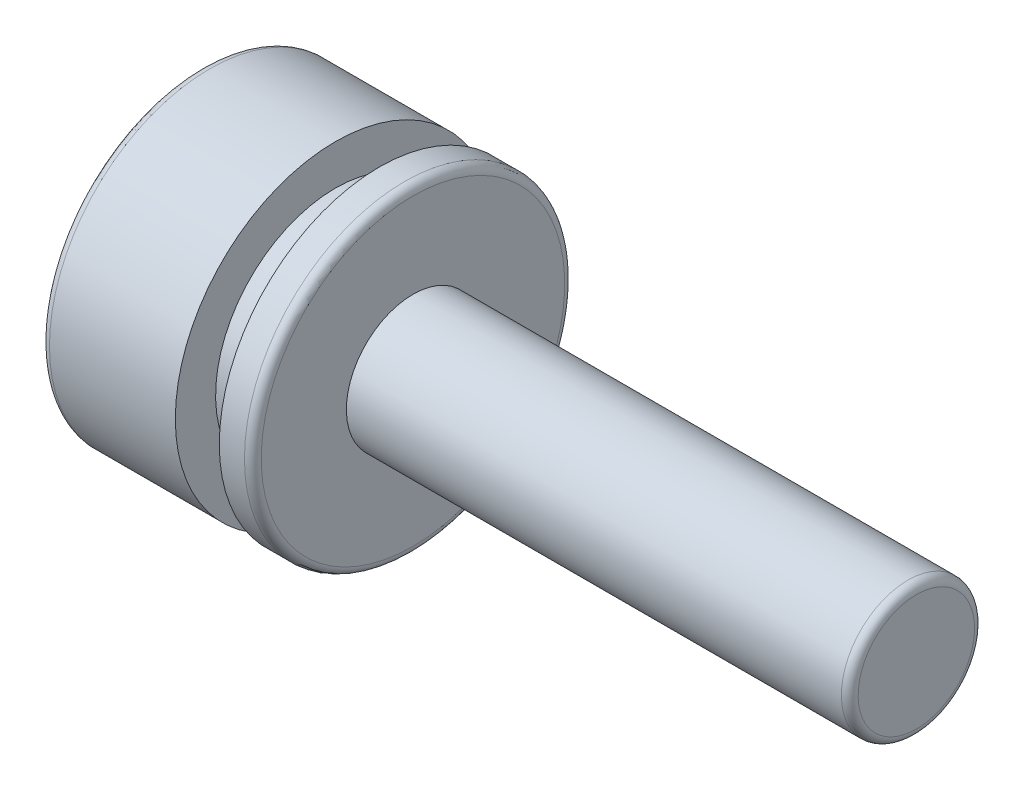
ISO-10303-21;
HEADER;
FILE_DESCRIPTION(('STEP AP214'),'2;1');
FILE_NAME('part.step','',(''),(''),'','','');
FILE_SCHEMA(('AUTOMOTIVE_DESIGN { 1 0 10303 214 1 1 1 1 }'));
ENDSEC;
DATA;
#1=APPLICATION_CONTEXT('core data for automotive mechanical design processes');
#2=APPLICATION_PROTOCOL_DEFINITION('international standard','automotive_design',2000,#1);
#3=PRODUCT_CONTEXT('',#1,'mechanical');
#4=PRODUCT('Part','Part','',(#3));
#5=PRODUCT_RELATED_PRODUCT_CATEGORY('part','',(#4));
#6=PRODUCT_DEFINITION_FORMATION('','',#4);
#7=PRODUCT_DEFINITION_CONTEXT('part definition',#1,'design');
#8=PRODUCT_DEFINITION('design','',#6,#7);
#9=PRODUCT_DEFINITION_SHAPE('','',#8);
#10=(LENGTH_UNIT() NAMED_UNIT(*) SI_UNIT(.MILLI.,.METRE.));
#11=(NAMED_UNIT(*) PLANE_ANGLE_UNIT() SI_UNIT($,.RADIAN.));
#12=(NAMED_UNIT(*) SI_UNIT($,.STERADIAN.) SOLID_ANGLE_UNIT());
#13=UNCERTAINTY_MEASURE_WITH_UNIT(LENGTH_MEASURE(1.E-05),#10,'distance_accuracy_value','');
#14=(GEOMETRIC_REPRESENTATION_CONTEXT(3) GLOBAL_UNCERTAINTY_ASSIGNED_CONTEXT((#13)) GLOBAL_UNIT_ASSIGNED_CONTEXT((#10,
#11,#12)) REPRESENTATION_CONTEXT('',''));
#15=CARTESIAN_POINT('',(0.,0.,0.));
#16=DIRECTION('',(0.,0.,1.));
#17=DIRECTION('',(1.,0.,0.));
#18=AXIS2_PLACEMENT_3D('',#15,#16,#17);
#19=CARTESIAN_POINT('',(42.62,0.,0.));
#20=DIRECTION('',(1.,0.,0.));
#21=DIRECTION('',(0.,1.,0.));
#22=AXIS2_PLACEMENT_3D('',#19,#20,#21);
#23=CYLINDRICAL_SURFACE('',#22,5.);
#24=CARTESIAN_POINT('',(0.5,0.,0.));
#25=DIRECTION('',(-1.,0.,0.));
#26=DIRECTION('',(0.,-1.,0.));
#27=AXIS2_PLACEMENT_3D('',#24,#25,#26);
#28=CIRCLE('',#27,5.);
#29=CARTESIAN_POINT('',(0.500000000000002,-5.00000000000001,0.));
#30=VERTEX_POINT('',#29);
#31=EDGE_CURVE('E76',#30,#30,#28,.T.);
#32=ORIENTED_EDGE('',*,*,#31,.T.);
#33=EDGE_LOOP('',(#32));
#34=FACE_BOUND('',#33,.T.);
#35=CARTESIAN_POINT('',(6.5,0.,0.));
#36=DIRECTION('',(1.,0.,0.));
#37=DIRECTION('',(0.,1.,0.));
#38=AXIS2_PLACEMENT_3D('',#35,#36,#37);
#39=CIRCLE('',#38,5.);
#40=CARTESIAN_POINT('',(6.5,4.99999999999999,0.));
#41=VERTEX_POINT('',#40);
#42=EDGE_CURVE('E48',#41,#41,#39,.T.);
#43=ORIENTED_EDGE('',*,*,#42,.T.);
#44=EDGE_LOOP('',(#43));
#45=FACE_BOUND('',#44,.T.);
#46=ADVANCED_FACE('F30',(#34,#45),#23,.F.);
#47=CARTESIAN_POINT('',(0.,4.99999999999999,0.));
#48=DIRECTION('',(-1.,0.,0.));
#49=DIRECTION('',(0.,-1.,0.));
#50=AXIS2_PLACEMENT_3D('',#47,#48,#49);
#51=PLANE('',#50);
#52=CARTESIAN_POINT('',(0.,0.,0.));
#53=DIRECTION('',(-1.,0.,0.));
#54=DIRECTION('',(0.,-1.,0.));
#55=AXIS2_PLACEMENT_3D('',#52,#53,#54);
#56=CIRCLE('',#55,9.04375000000001);
#57=CARTESIAN_POINT('',(0.,-9.04375000000002,0.));
#58=VERTEX_POINT('',#57);
#59=EDGE_CURVE('E82',#58,#58,#56,.T.);
#60=ORIENTED_EDGE('',*,*,#59,.T.);
#61=EDGE_LOOP('',(#60));
#62=FACE_BOUND('',#61,.T.);
#63=CARTESIAN_POINT('',(0.,0.,0.));
#64=DIRECTION('',(-1.,0.,0.));
#65=DIRECTION('',(0.,-1.,0.));
#66=AXIS2_PLACEMENT_3D('',#63,#64,#65);
#67=CIRCLE('',#66,5.5);
#68=CARTESIAN_POINT('',(0.,-5.50000000000001,0.));
#69=VERTEX_POINT('',#68);
#70=EDGE_CURVE('E73',#69,#69,#67,.F.);
#71=ORIENTED_EDGE('',*,*,#70,.T.);
#72=EDGE_LOOP('',(#71));
#73=FACE_BOUND('',#72,.T.);
#74=ADVANCED_FACE('F100',(#62,#73),#51,.T.);
#75=CARTESIAN_POINT('',(42.62,0.,0.));
#76=DIRECTION('',(1.,0.,0.));
#77=DIRECTION('',(0.,1.,0.));
#78=AXIS2_PLACEMENT_3D('',#75,#76,#77);
#79=CYLINDRICAL_SURFACE('',#78,9.54375000000001);
#80=CARTESIAN_POINT('',(0.5,0.,0.));
#81=DIRECTION('',(-1.,0.,0.));
#82=DIRECTION('',(0.,-1.,0.));
#83=AXIS2_PLACEMENT_3D('',#80,#81,#82);
#84=CIRCLE('',#83,9.54375000000001);
#85=CARTESIAN_POINT('',(0.500000000000003,-9.54375000000002,0.));
#86=VERTEX_POINT('',#85);
#87=EDGE_CURVE('E79',#86,#86,#84,.F.);
#88=ORIENTED_EDGE('',*,*,#87,.T.);
#89=EDGE_LOOP('',(#88));
#90=FACE_BOUND('',#89,.T.);
#91=CARTESIAN_POINT('',(8.,0.,0.));
#92=DIRECTION('',(1.,0.,0.));
#93=DIRECTION('',(0.,1.,0.));
#94=AXIS2_PLACEMENT_3D('',#91,#92,#93);
#95=CIRCLE('',#94,9.54375000000001);
#96=CARTESIAN_POINT('',(8.,9.54375,0.));
#97=VERTEX_POINT('',#96);
#98=EDGE_CURVE('E64',#97,#97,#95,.T.);
#99=ORIENTED_EDGE('',*,*,#98,.F.);
#100=EDGE_LOOP('',(#99));
#101=FACE_BOUND('',#100,.T.);
#102=ADVANCED_FACE('F106',(#90,#101),#79,.T.);
#103=CARTESIAN_POINT('',(8.,9.54375,0.));
#104=DIRECTION('',(1.,0.,0.));
#105=DIRECTION('',(0.,1.,0.));
#106=AXIS2_PLACEMENT_3D('',#103,#104,#105);
#107=PLANE('',#106);
#108=ORIENTED_EDGE('',*,*,#98,.T.);
#109=EDGE_LOOP('',(#108));
#110=FACE_BOUND('',#109,.T.);
#111=CARTESIAN_POINT('',(8.,0.,0.));
#112=DIRECTION('',(1.,0.,0.));
#113=DIRECTION('',(0.,1.,0.));
#114=AXIS2_PLACEMENT_3D('',#111,#112,#113);
#115=CIRCLE('',#114,7.14375000000001);
#116=CARTESIAN_POINT('',(8.,7.14375,0.));
#117=VERTEX_POINT('',#116);
#118=EDGE_CURVE('E61',#117,#117,#115,.T.);
#119=ORIENTED_EDGE('',*,*,#118,.F.);
#120=EDGE_LOOP('',(#119));
#121=FACE_BOUND('',#120,.T.);
#122=ADVANCED_FACE('F197',(#110,#121),#107,.T.);
#123=CARTESIAN_POINT('',(42.62,0.,0.));
#124=DIRECTION('',(1.,0.,0.));
#125=DIRECTION('',(0.,1.,0.));
#126=AXIS2_PLACEMENT_3D('',#123,#124,#125);
#127=CYLINDRICAL_SURFACE('',#126,7.14375000000001);
#128=ORIENTED_EDGE('',*,*,#118,.T.);
#129=EDGE_LOOP('',(#128));
#130=FACE_BOUND('',#129,.T.);
#131=CARTESIAN_POINT('',(10.62,0.,0.));
#132=DIRECTION('',(1.,0.,0.));
#133=DIRECTION('',(0.,1.,0.));
#134=AXIS2_PLACEMENT_3D('',#131,#132,#133);
#135=CIRCLE('',#134,7.14375000000001);
#136=CARTESIAN_POINT('',(10.62,7.14375,0.));
#137=VERTEX_POINT('',#136);
#138=EDGE_CURVE('E58',#137,#137,#135,.T.);
#139=ORIENTED_EDGE('',*,*,#138,.F.);
#140=EDGE_LOOP('',(#139));
#141=FACE_BOUND('',#140,.T.);
#142=ADVANCED_FACE('F187',(#130,#141),#127,.T.);
#143=CARTESIAN_POINT('',(10.62,7.14375,0.));
#144=DIRECTION('',(-1.,0.,0.));
#145=DIRECTION('',(0.,-1.,0.));
#146=AXIS2_PLACEMENT_3D('',#143,#144,#145);
#147=PLANE('',#146);
#148=ORIENTED_EDGE('',*,*,#138,.T.);
#149=EDGE_LOOP('',(#148));
#150=FACE_BOUND('',#149,.T.);
#151=CARTESIAN_POINT('',(10.62,0.,0.));
#152=DIRECTION('',(1.,0.,0.));
#153=DIRECTION('',(0.,1.,0.));
#154=AXIS2_PLACEMENT_3D('',#151,#152,#153);
#155=CIRCLE('',#154,9.54375000000001);
#156=CARTESIAN_POINT('',(10.62,9.54375,0.));
#157=VERTEX_POINT('',#156);
#158=EDGE_CURVE('E53',#157,#157,#155,.T.);
#159=ORIENTED_EDGE('',*,*,#158,.F.);
#160=EDGE_LOOP('',(#159));
#161=FACE_BOUND('',#160,.T.);
#162=ADVANCED_FACE('F144',(#150,#161),#147,.T.);
#163=CARTESIAN_POINT('',(42.62,0.,0.));
#164=DIRECTION('',(1.,0.,0.));
#165=DIRECTION('',(0.,1.,0.));
#166=AXIS2_PLACEMENT_3D('',#163,#164,#165);
#167=CYLINDRICAL_SURFACE('',#166,9.54375000000001);
#168=CARTESIAN_POINT('',(12.12,0.,0.));
#169=DIRECTION('',(1.,0.,0.));
#170=DIRECTION('',(0.,1.,0.));
#171=AXIS2_PLACEMENT_3D('',#168,#169,#170);
#172=CIRCLE('',#171,9.54375000000001);
#173=CARTESIAN_POINT('',(12.12,9.54375,0.));
#174=VERTEX_POINT('',#173);
#175=EDGE_CURVE('E11',#174,#174,#172,.F.);
#176=ORIENTED_EDGE('',*,*,#175,.T.);
#177=EDGE_LOOP('',(#176));
#178=FACE_BOUND('',#177,.T.);
#179=ORIENTED_EDGE('',*,*,#158,.T.);
#180=EDGE_LOOP('',(#179));
#181=FACE_BOUND('',#180,.T.);
#182=ADVANCED_FACE('F139',(#178,#181),#167,.T.);
#183=CARTESIAN_POINT('',(12.62,9.54375,0.));
#184=DIRECTION('',(1.,0.,0.));
#185=DIRECTION('',(0.,1.,0.));
#186=AXIS2_PLACEMENT_3D('',#183,#184,#185);
#187=PLANE('',#186);
#188=CARTESIAN_POINT('',(12.62,0.,0.));
#189=DIRECTION('',(1.,0.,0.));
#190=DIRECTION('',(0.,1.,0.));
#191=AXIS2_PLACEMENT_3D('',#188,#189,#190);
#192=CIRCLE('',#191,9.04375000000001);
#193=CARTESIAN_POINT('',(12.62,9.04375,0.));
#194=VERTEX_POINT('',#193);
#195=EDGE_CURVE('E37',#194,#194,#192,.T.);
#196=ORIENTED_EDGE('',*,*,#195,.T.);
#197=EDGE_LOOP('',(#196));
#198=FACE_BOUND('',#197,.T.);
#199=CARTESIAN_POINT('',(12.62,0.,0.));
#200=DIRECTION('',(1.,0.,0.));
#201=DIRECTION('',(0.,1.,0.));
#202=AXIS2_PLACEMENT_3D('',#199,#200,#201);
#203=CIRCLE('',#202,3.96875000000001);
#204=CARTESIAN_POINT('',(12.62,3.96875,0.));
#205=VERTEX_POINT('',#204);
#206=EDGE_CURVE('E50',#205,#205,#203,.T.);
#207=ORIENTED_EDGE('',*,*,#206,.F.);
#208=EDGE_LOOP('',(#207));
#209=FACE_BOUND('',#208,.T.);
#210=ADVANCED_FACE('F87',(#198,#209),#187,.T.);
#211=CARTESIAN_POINT('',(42.62,0.,0.));
#212=DIRECTION('',(1.,0.,0.));
#213=DIRECTION('',(0.,1.,0.));
#214=AXIS2_PLACEMENT_3D('',#211,#212,#213);
#215=CYLINDRICAL_SURFACE('',#214,3.96875);
#216=CARTESIAN_POINT('',(42.12,0.,0.));
#217=DIRECTION('',(1.,0.,0.));
#218=DIRECTION('',(0.,1.,0.));
#219=AXIS2_PLACEMENT_3D('',#216,#217,#218);
#220=CIRCLE('',#219,3.96875);
#221=CARTESIAN_POINT('',(42.12,3.96875000000001,0.));
#222=VERTEX_POINT('',#221);
#223=EDGE_CURVE('E70',#222,#222,#220,.F.);
#224=ORIENTED_EDGE('',*,*,#223,.T.);
#225=EDGE_LOOP('',(#224));
#226=FACE_BOUND('',#225,.T.);
#227=ORIENTED_EDGE('',*,*,#206,.T.);
#228=EDGE_LOOP('',(#227));
#229=FACE_BOUND('',#228,.T.);
#230=ADVANCED_FACE('F155',(#226,#229),#215,.T.);
#231=CARTESIAN_POINT('',(42.62,3.96875,0.));
#232=DIRECTION('',(1.,0.,0.));
#233=DIRECTION('',(0.,1.,0.));
#234=AXIS2_PLACEMENT_3D('',#231,#232,#233);
#235=PLANE('',#234);
#236=CARTESIAN_POINT('',(42.62,0.,0.));
#237=DIRECTION('',(1.,0.,0.));
#238=DIRECTION('',(0.,1.,0.));
#239=AXIS2_PLACEMENT_3D('',#236,#237,#238);
#240=CIRCLE('',#239,3.46875);
#241=CARTESIAN_POINT('',(42.62,3.46875000000001,0.));
#242=VERTEX_POINT('',#241);
#243=EDGE_CURVE('E67',#242,#242,#240,.T.);
#244=ORIENTED_EDGE('',*,*,#243,.T.);
#245=EDGE_LOOP('',(#244));
#246=FACE_BOUND('',#245,.T.);
#247=ADVANCED_FACE('F44',(#246),#235,.T.);
#248=CARTESIAN_POINT('',(6.5,0.,0.));
#249=DIRECTION('',(-1.,0.,0.));
#250=DIRECTION('',(0.,-1.,0.));
#251=AXIS2_PLACEMENT_3D('',#248,#249,#250);
#252=CONICAL_SURFACE('',#251,5.,1.04719755119659);
#253=CARTESIAN_POINT('',(9.38675134594816,0.,0.));
#254=VERTEX_POINT('',#253);
#255=VERTEX_LOOP('',#254);
#256=FACE_BOUND('',#255,.T.);
#257=ORIENTED_EDGE('',*,*,#42,.F.);
#258=EDGE_LOOP('',(#257));
#259=FACE_BOUND('',#258,.T.);
#260=ADVANCED_FACE('F40',(#256,#259),#252,.F.);
#261=CARTESIAN_POINT('',(42.12,0.,0.));
#262=DIRECTION('',(1.,0.,0.));
#263=DIRECTION('',(0.,1.,0.));
#264=AXIS2_PLACEMENT_3D('',#261,#262,#263);
#265=TOROIDAL_SURFACE('',#264,3.46875,0.5);
#266=ORIENTED_EDGE('',*,*,#223,.F.);
#267=EDGE_LOOP('',(#266));
#268=FACE_BOUND('',#267,.T.);
#269=ORIENTED_EDGE('',*,*,#243,.F.);
#270=EDGE_LOOP('',(#269));
#271=FACE_BOUND('',#270,.T.);
#272=ADVANCED_FACE('F43',(#268,#271),#265,.T.);
#273=CARTESIAN_POINT('',(0.5,0.,0.));
#274=DIRECTION('',(-1.,0.,0.));
#275=DIRECTION('',(0.,-1.,0.));
#276=AXIS2_PLACEMENT_3D('',#273,#274,#275);
#277=TOROIDAL_SURFACE('',#276,5.5,0.5);
#278=ORIENTED_EDGE('',*,*,#31,.F.);
#279=EDGE_LOOP('',(#278));
#280=FACE_BOUND('',#279,.T.);
#281=ORIENTED_EDGE('',*,*,#70,.F.);
#282=EDGE_LOOP('',(#281));
#283=FACE_BOUND('',#282,.T.);
#284=ADVANCED_FACE('F96',(#280,#283),#277,.T.);
#285=CARTESIAN_POINT('',(0.5,0.,0.));
#286=DIRECTION('',(-1.,0.,0.));
#287=DIRECTION('',(0.,-1.,0.));
#288=AXIS2_PLACEMENT_3D('',#285,#286,#287);
#289=TOROIDAL_SURFACE('',#288,9.04375000000001,0.5);
#290=ORIENTED_EDGE('',*,*,#59,.F.);
#291=EDGE_LOOP('',(#290));
#292=FACE_BOUND('',#291,.T.);
#293=ORIENTED_EDGE('',*,*,#87,.F.);
#294=EDGE_LOOP('',(#293));
#295=FACE_BOUND('',#294,.T.);
#296=ADVANCED_FACE('F91',(#292,#295),#289,.T.);
#297=CARTESIAN_POINT('',(12.12,0.,0.));
#298=DIRECTION('',(1.,0.,0.));
#299=DIRECTION('',(0.,1.,0.));
#300=AXIS2_PLACEMENT_3D('',#297,#298,#299);
#301=TOROIDAL_SURFACE('',#300,9.04375000000001,0.5);
#302=ORIENTED_EDGE('',*,*,#175,.F.);
#303=EDGE_LOOP('',(#302));
#304=FACE_BOUND('',#303,.T.);
#305=ORIENTED_EDGE('',*,*,#195,.F.);
#306=EDGE_LOOP('',(#305));
#307=FACE_BOUND('',#306,.T.);
#308=ADVANCED_FACE('F32',(#304,#307),#301,.T.);
#309=CLOSED_SHELL('',(#46,#74,#102,#122,#142,#162,#182,#210,#230,#247,#260,#272,#284,#296,#308));
#310=MANIFOLD_SOLID_BREP('B2',#309);
#311=ADVANCED_BREP_SHAPE_REPRESENTATION('',(#18,#310),#14);
#312=SHAPE_DEFINITION_REPRESENTATION(#9,#311);
ENDSEC;
END-ISO-10303-21;
